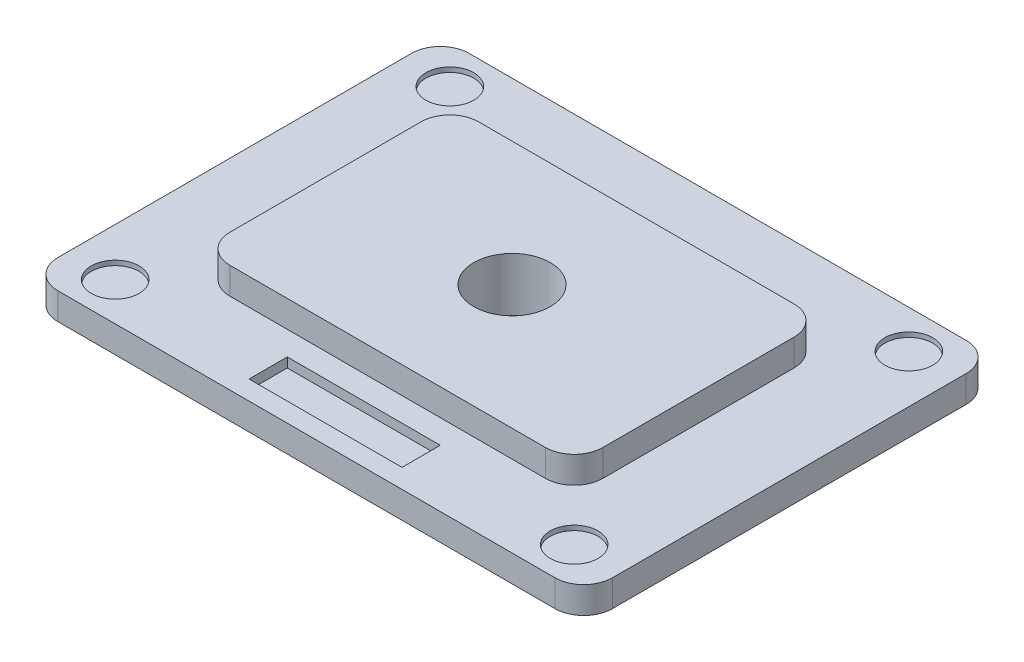
ISO-10303-21;
HEADER;
FILE_DESCRIPTION(('STEP AP214'),'2;1');
FILE_NAME('part.step','',(''),(''),'','','');
FILE_SCHEMA(('AUTOMOTIVE_DESIGN { 1 0 10303 214 1 1 1 1 }'));
ENDSEC;
DATA;
#1=APPLICATION_CONTEXT('core data for automotive mechanical design processes');
#2=APPLICATION_PROTOCOL_DEFINITION('international standard','automotive_design',2000,#1);
#3=PRODUCT_CONTEXT('',#1,'mechanical');
#4=PRODUCT('Part','Part','',(#3));
#5=PRODUCT_RELATED_PRODUCT_CATEGORY('part','',(#4));
#6=PRODUCT_DEFINITION_FORMATION('','',#4);
#7=PRODUCT_DEFINITION_CONTEXT('part definition',#1,'design');
#8=PRODUCT_DEFINITION('design','',#6,#7);
#9=PRODUCT_DEFINITION_SHAPE('','',#8);
#10=(LENGTH_UNIT() NAMED_UNIT(*) SI_UNIT(.MILLI.,.METRE.));
#11=(NAMED_UNIT(*) PLANE_ANGLE_UNIT() SI_UNIT($,.RADIAN.));
#12=(NAMED_UNIT(*) SI_UNIT($,.STERADIAN.) SOLID_ANGLE_UNIT());
#13=UNCERTAINTY_MEASURE_WITH_UNIT(LENGTH_MEASURE(1.E-05),#10,'distance_accuracy_value','');
#14=(GEOMETRIC_REPRESENTATION_CONTEXT(3) GLOBAL_UNCERTAINTY_ASSIGNED_CONTEXT((#13)) GLOBAL_UNIT_ASSIGNED_CONTEXT((#10,
#11,#12)) REPRESENTATION_CONTEXT('',''));
#15=CARTESIAN_POINT('',(0.,0.,0.));
#16=DIRECTION('',(0.,0.,1.));
#17=DIRECTION('',(1.,0.,0.));
#18=AXIS2_PLACEMENT_3D('',#15,#16,#17);
#19=CARTESIAN_POINT('',(0.,3.556,0.));
#20=DIRECTION('',(0.,-1.,0.));
#21=DIRECTION('',(0.,0.,-1.));
#22=AXIS2_PLACEMENT_3D('',#19,#20,#21);
#23=PLANE('',#22);
#24=CARTESIAN_POINT('',(-30.48,3.556,22.225));
#25=DIRECTION('',(0.,1.,0.));
#26=DIRECTION('',(0.,0.,1.));
#27=AXIS2_PLACEMENT_3D('',#24,#25,#26);
#28=CIRCLE('',#27,3.175);
#29=CARTESIAN_POINT('',(-30.48,3.556,25.4));
#30=VERTEX_POINT('',#29);
#31=EDGE_CURVE('E814',#30,#30,#28,.T.);
#32=ORIENTED_EDGE('',*,*,#31,.F.);
#33=EDGE_LOOP('',(#32));
#34=FACE_BOUND('',#33,.T.);
#35=CARTESIAN_POINT('',(-30.48,3.556,-22.225));
#36=DIRECTION('',(0.,1.,0.));
#37=DIRECTION('',(0.,0.,1.));
#38=AXIS2_PLACEMENT_3D('',#35,#36,#37);
#39=CIRCLE('',#38,3.175);
#40=CARTESIAN_POINT('',(-30.48,3.556,-19.05));
#41=VERTEX_POINT('',#40);
#42=EDGE_CURVE('E818',#41,#41,#39,.T.);
#43=ORIENTED_EDGE('',*,*,#42,.F.);
#44=EDGE_LOOP('',(#43));
#45=FACE_BOUND('',#44,.T.);
#46=CARTESIAN_POINT('',(30.48,3.556,-22.225));
#47=DIRECTION('',(0.,1.,0.));
#48=DIRECTION('',(0.,0.,1.));
#49=AXIS2_PLACEMENT_3D('',#46,#47,#48);
#50=CIRCLE('',#49,3.175);
#51=CARTESIAN_POINT('',(30.48,3.556,-19.05));
#52=VERTEX_POINT('',#51);
#53=EDGE_CURVE('E828',#52,#52,#50,.T.);
#54=ORIENTED_EDGE('',*,*,#53,.F.);
#55=EDGE_LOOP('',(#54));
#56=FACE_BOUND('',#55,.T.);
#57=CARTESIAN_POINT('',(30.48,3.556,22.225));
#58=DIRECTION('',(0.,1.,0.));
#59=DIRECTION('',(0.,0.,1.));
#60=AXIS2_PLACEMENT_3D('',#57,#58,#59);
#61=CIRCLE('',#60,3.175);
#62=CARTESIAN_POINT('',(30.48,3.556,25.4));
#63=VERTEX_POINT('',#62);
#64=EDGE_CURVE('E835',#63,#63,#61,.T.);
#65=ORIENTED_EDGE('',*,*,#64,.F.);
#66=EDGE_LOOP('',(#65));
#67=FACE_BOUND('',#66,.T.);
#68=DIRECTION('',(1.,0.,0.));
#69=VECTOR('',#68,1.);
#70=CARTESIAN_POINT('',(-10.16,3.556,24.765));
#71=LINE('',#70,#69);
#72=CARTESIAN_POINT('',(-10.16,3.556,24.765));
#73=VERTEX_POINT('',#72);
#74=CARTESIAN_POINT('',(10.16,3.556,24.765));
#75=VERTEX_POINT('',#74);
#76=EDGE_CURVE('E219',#73,#75,#71,.T.);
#77=ORIENTED_EDGE('',*,*,#76,.F.);
#78=DIRECTION('',(0.,0.,1.));
#79=VECTOR('',#78,1.);
#80=CARTESIAN_POINT('',(-10.16,3.556,19.685));
#81=LINE('',#80,#79);
#82=CARTESIAN_POINT('',(-10.16,3.556,19.685));
#83=VERTEX_POINT('',#82);
#84=EDGE_CURVE('E59',#83,#73,#81,.T.);
#85=ORIENTED_EDGE('',*,*,#84,.F.);
#86=DIRECTION('',(-1.,0.,0.));
#87=VECTOR('',#86,1.);
#88=CARTESIAN_POINT('',(-10.16,3.556,19.685));
#89=LINE('',#88,#87);
#90=CARTESIAN_POINT('',(10.16,3.556,19.685));
#91=VERTEX_POINT('',#90);
#92=EDGE_CURVE('E203',#91,#83,#89,.T.);
#93=ORIENTED_EDGE('',*,*,#92,.F.);
#94=DIRECTION('',(0.,0.,-1.));
#95=VECTOR('',#94,1.);
#96=CARTESIAN_POINT('',(10.16,3.556,19.685));
#97=LINE('',#96,#95);
#98=EDGE_CURVE('E207',#75,#91,#97,.T.);
#99=ORIENTED_EDGE('',*,*,#98,.F.);
#100=EDGE_LOOP('',(#77,#85,#93,#99));
#101=FACE_BOUND('',#100,.T.);
#102=DIRECTION('',(-1.,0.,0.));
#103=VECTOR('',#102,1.);
#104=CARTESIAN_POINT('',(-36.83,3.556,-27.305));
#105=LINE('',#104,#103);
#106=CARTESIAN_POINT('',(33.02,3.556,-27.305));
#107=VERTEX_POINT('',#106);
#108=CARTESIAN_POINT('',(-33.02,3.556,-27.305));
#109=VERTEX_POINT('',#108);
#110=EDGE_CURVE('E286',#107,#109,#105,.T.);
#111=ORIENTED_EDGE('',*,*,#110,.T.);
#112=CARTESIAN_POINT('',(-33.02,3.556,-23.495));
#113=DIRECTION('',(0.,-1.,0.));
#114=DIRECTION('',(0.,0.,-1.));
#115=AXIS2_PLACEMENT_3D('',#112,#113,#114);
#116=CIRCLE('',#115,3.81);
#117=CARTESIAN_POINT('',(-36.83,3.556,-23.495));
#118=VERTEX_POINT('',#117);
#119=EDGE_CURVE('E372',#109,#118,#116,.F.);
#120=ORIENTED_EDGE('',*,*,#119,.T.);
#121=DIRECTION('',(0.,0.,1.));
#122=VECTOR('',#121,1.);
#123=CARTESIAN_POINT('',(-36.83,3.556,27.305));
#124=LINE('',#123,#122);
#125=CARTESIAN_POINT('',(-36.83,3.556,23.495));
#126=VERTEX_POINT('',#125);
#127=EDGE_CURVE('E273',#118,#126,#124,.T.);
#128=ORIENTED_EDGE('',*,*,#127,.T.);
#129=CARTESIAN_POINT('',(-33.02,3.556,23.495));
#130=DIRECTION('',(0.,-1.,0.));
#131=DIRECTION('',(0.,0.,-1.));
#132=AXIS2_PLACEMENT_3D('',#129,#130,#131);
#133=CIRCLE('',#132,3.81);
#134=CARTESIAN_POINT('',(-33.02,3.556,27.305));
#135=VERTEX_POINT('',#134);
#136=EDGE_CURVE('E366',#126,#135,#133,.F.);
#137=ORIENTED_EDGE('',*,*,#136,.T.);
#138=DIRECTION('',(1.,0.,0.));
#139=VECTOR('',#138,1.);
#140=CARTESIAN_POINT('',(36.83,3.556,27.305));
#141=LINE('',#140,#139);
#142=CARTESIAN_POINT('',(33.02,3.556,27.305));
#143=VERTEX_POINT('',#142);
#144=EDGE_CURVE('E277',#135,#143,#141,.T.);
#145=ORIENTED_EDGE('',*,*,#144,.T.);
#146=CARTESIAN_POINT('',(33.02,3.556,23.495));
#147=DIRECTION('',(0.,-1.,0.));
#148=DIRECTION('',(0.,0.,-1.));
#149=AXIS2_PLACEMENT_3D('',#146,#147,#148);
#150=CIRCLE('',#149,3.81);
#151=CARTESIAN_POINT('',(36.83,3.556,23.495));
#152=VERTEX_POINT('',#151);
#153=EDGE_CURVE('E363',#143,#152,#150,.F.);
#154=ORIENTED_EDGE('',*,*,#153,.T.);
#155=DIRECTION('',(0.,0.,-1.));
#156=VECTOR('',#155,1.);
#157=CARTESIAN_POINT('',(36.83,3.556,-27.305));
#158=LINE('',#157,#156);
#159=CARTESIAN_POINT('',(36.83,3.556,-23.495));
#160=VERTEX_POINT('',#159);
#161=EDGE_CURVE('E282',#152,#160,#158,.T.);
#162=ORIENTED_EDGE('',*,*,#161,.T.);
#163=CARTESIAN_POINT('',(33.02,3.556,-23.495));
#164=DIRECTION('',(0.,-1.,0.));
#165=DIRECTION('',(0.,0.,-1.));
#166=AXIS2_PLACEMENT_3D('',#163,#164,#165);
#167=CIRCLE('',#166,3.81);
#168=EDGE_CURVE('E369',#160,#107,#167,.F.);
#169=ORIENTED_EDGE('',*,*,#168,.T.);
#170=EDGE_LOOP('',(#111,#120,#128,#137,#145,#154,#162,#169));
#171=FACE_BOUND('',#170,.T.);
#172=DIRECTION('',(-1.,0.,0.));
#173=VECTOR('',#172,1.);
#174=CARTESIAN_POINT('',(24.765,3.556,-16.51));
#175=LINE('',#174,#173);
#176=CARTESIAN_POINT('',(20.955,3.556,-16.51));
#177=VERTEX_POINT('',#176);
#178=CARTESIAN_POINT('',(-20.955,3.556,-16.51));
#179=VERTEX_POINT('',#178);
#180=EDGE_CURVE('E241',#177,#179,#175,.T.);
#181=ORIENTED_EDGE('',*,*,#180,.F.);
#182=CARTESIAN_POINT('',(20.955,3.556,-12.7));
#183=DIRECTION('',(0.,-1.,0.));
#184=DIRECTION('',(0.,0.,-1.));
#185=AXIS2_PLACEMENT_3D('',#182,#183,#184);
#186=CIRCLE('',#185,3.81);
#187=CARTESIAN_POINT('',(24.765,3.556,-12.7));
#188=VERTEX_POINT('',#187);
#189=EDGE_CURVE('E52',#177,#188,#186,.T.);
#190=ORIENTED_EDGE('',*,*,#189,.T.);
#191=DIRECTION('',(0.,0.,-1.));
#192=VECTOR('',#191,1.);
#193=CARTESIAN_POINT('',(24.765,3.556,16.51));
#194=LINE('',#193,#192);
#195=CARTESIAN_POINT('',(24.765,3.556,12.7));
#196=VERTEX_POINT('',#195);
#197=EDGE_CURVE('E247',#196,#188,#194,.T.);
#198=ORIENTED_EDGE('',*,*,#197,.F.);
#199=CARTESIAN_POINT('',(20.955,3.556,12.7));
#200=DIRECTION('',(0.,-1.,0.));
#201=DIRECTION('',(0.,0.,-1.));
#202=AXIS2_PLACEMENT_3D('',#199,#200,#201);
#203=CIRCLE('',#202,3.81);
#204=CARTESIAN_POINT('',(20.955,3.556,16.51));
#205=VERTEX_POINT('',#204);
#206=EDGE_CURVE('E11',#196,#205,#203,.T.);
#207=ORIENTED_EDGE('',*,*,#206,.T.);
#208=DIRECTION('',(1.,0.,0.));
#209=VECTOR('',#208,1.);
#210=CARTESIAN_POINT('',(-24.765,3.556,16.51));
#211=LINE('',#210,#209);
#212=CARTESIAN_POINT('',(-20.955,3.556,16.51));
#213=VERTEX_POINT('',#212);
#214=EDGE_CURVE('E267',#213,#205,#211,.T.);
#215=ORIENTED_EDGE('',*,*,#214,.F.);
#216=CARTESIAN_POINT('',(-20.955,3.556,12.7));
#217=DIRECTION('',(0.,-1.,0.));
#218=DIRECTION('',(0.,0.,-1.));
#219=AXIS2_PLACEMENT_3D('',#216,#217,#218);
#220=CIRCLE('',#219,3.81);
#221=CARTESIAN_POINT('',(-24.765,3.556,12.7));
#222=VERTEX_POINT('',#221);
#223=EDGE_CURVE('E396',#213,#222,#220,.T.);
#224=ORIENTED_EDGE('',*,*,#223,.T.);
#225=DIRECTION('',(0.,0.,1.));
#226=VECTOR('',#225,1.);
#227=CARTESIAN_POINT('',(-24.765,3.556,-16.51));
#228=LINE('',#227,#226);
#229=CARTESIAN_POINT('',(-24.765,3.556,-12.7));
#230=VERTEX_POINT('',#229);
#231=EDGE_CURVE('E263',#230,#222,#228,.T.);
#232=ORIENTED_EDGE('',*,*,#231,.F.);
#233=CARTESIAN_POINT('',(-20.955,3.556,-12.7));
#234=DIRECTION('',(0.,-1.,0.));
#235=DIRECTION('',(0.,0.,-1.));
#236=AXIS2_PLACEMENT_3D('',#233,#234,#235);
#237=CIRCLE('',#236,3.81);
#238=EDGE_CURVE('E399',#230,#179,#237,.T.);
#239=ORIENTED_EDGE('',*,*,#238,.T.);
#240=EDGE_LOOP('',(#181,#190,#198,#207,#215,#224,#232,#239));
#241=FACE_BOUND('',#240,.T.);
#242=ADVANCED_FACE('F43',(#34,#45,#56,#67,#101,#171,#241),#23,.F.);
#243=CARTESIAN_POINT('',(-36.83,3.556,27.305));
#244=DIRECTION('',(1.,0.,0.));
#245=DIRECTION('',(0.,0.,-1.));
#246=AXIS2_PLACEMENT_3D('',#243,#244,#245);
#247=PLANE('',#246);
#248=ORIENTED_EDGE('',*,*,#127,.F.);
#249=DIRECTION('',(0.,-1.,0.));
#250=VECTOR('',#249,1.);
#251=CARTESIAN_POINT('',(-36.83,3.556,-23.495));
#252=LINE('',#251,#250);
#253=CARTESIAN_POINT('',(-36.83,0.,-23.495));
#254=VERTEX_POINT('',#253);
#255=EDGE_CURVE('E340',#118,#254,#252,.T.);
#256=ORIENTED_EDGE('',*,*,#255,.T.);
#257=DIRECTION('',(0.,0.,1.));
#258=VECTOR('',#257,1.);
#259=CARTESIAN_POINT('',(-36.83,0.,27.305));
#260=LINE('',#259,#258);
#261=CARTESIAN_POINT('',(-36.83,0.,23.495));
#262=VERTEX_POINT('',#261);
#263=EDGE_CURVE('E259',#254,#262,#260,.T.);
#264=ORIENTED_EDGE('',*,*,#263,.T.);
#265=DIRECTION('',(0.,-1.,0.));
#266=VECTOR('',#265,1.);
#267=CARTESIAN_POINT('',(-36.83,3.556,23.495));
#268=LINE('',#267,#266);
#269=EDGE_CURVE('E337',#262,#126,#268,.F.);
#270=ORIENTED_EDGE('',*,*,#269,.T.);
#271=EDGE_LOOP('',(#248,#256,#264,#270));
#272=FACE_BOUND('',#271,.T.);
#273=ADVANCED_FACE('F452',(#272),#247,.F.);
#274=CARTESIAN_POINT('',(36.83,3.556,27.305));
#275=DIRECTION('',(0.,0.,-1.));
#276=DIRECTION('',(-1.,0.,0.));
#277=AXIS2_PLACEMENT_3D('',#274,#275,#276);
#278=PLANE('',#277);
#279=ORIENTED_EDGE('',*,*,#144,.F.);
#280=DIRECTION('',(0.,-1.,0.));
#281=VECTOR('',#280,1.);
#282=CARTESIAN_POINT('',(-33.02,3.556,27.305));
#283=LINE('',#282,#281);
#284=CARTESIAN_POINT('',(-33.02,0.,27.305));
#285=VERTEX_POINT('',#284);
#286=EDGE_CURVE('E392',#135,#285,#283,.T.);
#287=ORIENTED_EDGE('',*,*,#286,.T.);
#288=DIRECTION('',(1.,0.,0.));
#289=VECTOR('',#288,1.);
#290=CARTESIAN_POINT('',(36.83,0.,27.305));
#291=LINE('',#290,#289);
#292=CARTESIAN_POINT('',(33.02,0.,27.305));
#293=VERTEX_POINT('',#292);
#294=EDGE_CURVE('E294',#285,#293,#291,.T.);
#295=ORIENTED_EDGE('',*,*,#294,.T.);
#296=DIRECTION('',(0.,-1.,0.));
#297=VECTOR('',#296,1.);
#298=CARTESIAN_POINT('',(33.02,3.556,27.305));
#299=LINE('',#298,#297);
#300=EDGE_CURVE('E389',#293,#143,#299,.F.);
#301=ORIENTED_EDGE('',*,*,#300,.T.);
#302=EDGE_LOOP('',(#279,#287,#295,#301));
#303=FACE_BOUND('',#302,.T.);
#304=ADVANCED_FACE('F458',(#303),#278,.F.);
#305=CARTESIAN_POINT('',(36.83,3.556,-27.305));
#306=DIRECTION('',(-1.,0.,0.));
#307=DIRECTION('',(0.,0.,1.));
#308=AXIS2_PLACEMENT_3D('',#305,#306,#307);
#309=PLANE('',#308);
#310=DIRECTION('',(0.,0.,-1.));
#311=VECTOR('',#310,1.);
#312=CARTESIAN_POINT('',(36.83,0.,-27.305));
#313=LINE('',#312,#311);
#314=CARTESIAN_POINT('',(36.83,0.,23.495));
#315=VERTEX_POINT('',#314);
#316=CARTESIAN_POINT('',(36.83,0.,-23.495));
#317=VERTEX_POINT('',#316);
#318=EDGE_CURVE('E298',#315,#317,#313,.T.);
#319=ORIENTED_EDGE('',*,*,#318,.T.);
#320=DIRECTION('',(0.,-1.,0.));
#321=VECTOR('',#320,1.);
#322=CARTESIAN_POINT('',(36.83,3.556,-23.495));
#323=LINE('',#322,#321);
#324=EDGE_CURVE('E386',#317,#160,#323,.F.);
#325=ORIENTED_EDGE('',*,*,#324,.T.);
#326=ORIENTED_EDGE('',*,*,#161,.F.);
#327=DIRECTION('',(0.,-1.,0.));
#328=VECTOR('',#327,1.);
#329=CARTESIAN_POINT('',(36.83,3.556,23.495));
#330=LINE('',#329,#328);
#331=EDGE_CURVE('E382',#152,#315,#330,.T.);
#332=ORIENTED_EDGE('',*,*,#331,.T.);
#333=EDGE_LOOP('',(#319,#325,#326,#332));
#334=FACE_BOUND('',#333,.T.);
#335=ADVANCED_FACE('F473',(#334),#309,.F.);
#336=CARTESIAN_POINT('',(-36.83,3.556,-27.305));
#337=DIRECTION('',(0.,0.,1.));
#338=DIRECTION('',(1.,0.,0.));
#339=AXIS2_PLACEMENT_3D('',#336,#337,#338);
#340=PLANE('',#339);
#341=DIRECTION('',(-1.,0.,0.));
#342=VECTOR('',#341,1.);
#343=CARTESIAN_POINT('',(-36.83,0.,-27.305));
#344=LINE('',#343,#342);
#345=CARTESIAN_POINT('',(33.02,0.,-27.305));
#346=VERTEX_POINT('',#345);
#347=CARTESIAN_POINT('',(-33.02,0.,-27.305));
#348=VERTEX_POINT('',#347);
#349=EDGE_CURVE('E278',#346,#348,#344,.T.);
#350=ORIENTED_EDGE('',*,*,#349,.T.);
#351=DIRECTION('',(0.,-1.,0.));
#352=VECTOR('',#351,1.);
#353=CARTESIAN_POINT('',(-33.02,3.556,-27.305));
#354=LINE('',#353,#352);
#355=EDGE_CURVE('E360',#348,#109,#354,.F.);
#356=ORIENTED_EDGE('',*,*,#355,.T.);
#357=ORIENTED_EDGE('',*,*,#110,.F.);
#358=DIRECTION('',(0.,-1.,0.));
#359=VECTOR('',#358,1.);
#360=CARTESIAN_POINT('',(33.02,3.556,-27.305));
#361=LINE('',#360,#359);
#362=EDGE_CURVE('E356',#107,#346,#361,.T.);
#363=ORIENTED_EDGE('',*,*,#362,.T.);
#364=EDGE_LOOP('',(#350,#356,#357,#363));
#365=FACE_BOUND('',#364,.T.);
#366=ADVANCED_FACE('F469',(#365),#340,.F.);
#367=CARTESIAN_POINT('',(0.,0.,0.));
#368=DIRECTION('',(0.,-1.,0.));
#369=DIRECTION('',(0.,0.,-1.));
#370=AXIS2_PLACEMENT_3D('',#367,#368,#369);
#371=PLANE('',#370);
#372=CARTESIAN_POINT('',(0.,0.,0.));
#373=DIRECTION('',(0.,1.,0.));
#374=DIRECTION('',(0.,0.,1.));
#375=AXIS2_PLACEMENT_3D('',#372,#373,#374);
#376=CIRCLE('',#375,5.08);
#377=CARTESIAN_POINT('',(0.,0.,5.08));
#378=VERTEX_POINT('',#377);
#379=EDGE_CURVE('E237',#378,#378,#376,.T.);
#380=ORIENTED_EDGE('',*,*,#379,.T.);
#381=EDGE_LOOP('',(#380));
#382=FACE_BOUND('',#381,.T.);
#383=ORIENTED_EDGE('',*,*,#263,.F.);
#384=CARTESIAN_POINT('',(-33.02,0.,-23.495));
#385=DIRECTION('',(0.,-1.,0.));
#386=DIRECTION('',(0.,0.,-1.));
#387=AXIS2_PLACEMENT_3D('',#384,#385,#386);
#388=CIRCLE('',#387,3.81);
#389=EDGE_CURVE('E353',#254,#348,#388,.T.);
#390=ORIENTED_EDGE('',*,*,#389,.T.);
#391=ORIENTED_EDGE('',*,*,#349,.F.);
#392=CARTESIAN_POINT('',(33.02,0.,-23.495));
#393=DIRECTION('',(0.,-1.,0.));
#394=DIRECTION('',(0.,0.,-1.));
#395=AXIS2_PLACEMENT_3D('',#392,#393,#394);
#396=CIRCLE('',#395,3.81);
#397=EDGE_CURVE('E350',#346,#317,#396,.T.);
#398=ORIENTED_EDGE('',*,*,#397,.T.);
#399=ORIENTED_EDGE('',*,*,#318,.F.);
#400=CARTESIAN_POINT('',(33.02,0.,23.495));
#401=DIRECTION('',(0.,-1.,0.));
#402=DIRECTION('',(0.,0.,-1.));
#403=AXIS2_PLACEMENT_3D('',#400,#401,#402);
#404=CIRCLE('',#403,3.81);
#405=EDGE_CURVE('E344',#315,#293,#404,.T.);
#406=ORIENTED_EDGE('',*,*,#405,.T.);
#407=ORIENTED_EDGE('',*,*,#294,.F.);
#408=CARTESIAN_POINT('',(-33.02,0.,23.495));
#409=DIRECTION('',(0.,-1.,0.));
#410=DIRECTION('',(0.,0.,-1.));
#411=AXIS2_PLACEMENT_3D('',#408,#409,#410);
#412=CIRCLE('',#411,3.81);
#413=EDGE_CURVE('E347',#285,#262,#412,.T.);
#414=ORIENTED_EDGE('',*,*,#413,.T.);
#415=EDGE_LOOP('',(#383,#390,#391,#398,#399,#406,#407,#414));
#416=FACE_BOUND('',#415,.T.);
#417=ADVANCED_FACE('F466',(#382,#416),#371,.T.);
#418=CARTESIAN_POINT('',(24.765,7.112,-16.51));
#419=DIRECTION('',(0.,0.,1.));
#420=DIRECTION('',(1.,0.,0.));
#421=AXIS2_PLACEMENT_3D('',#418,#419,#420);
#422=PLANE('',#421);
#423=ORIENTED_EDGE('',*,*,#180,.T.);
#424=DIRECTION('',(0.,-1.,0.));
#425=VECTOR('',#424,1.);
#426=CARTESIAN_POINT('',(-20.955,7.112,-16.51));
#427=LINE('',#426,#425);
#428=CARTESIAN_POINT('',(-20.955,7.112,-16.51));
#429=VERTEX_POINT('',#428);
#430=EDGE_CURVE('E334',#179,#429,#427,.F.);
#431=ORIENTED_EDGE('',*,*,#430,.T.);
#432=DIRECTION('',(-1.,0.,0.));
#433=VECTOR('',#432,1.);
#434=CARTESIAN_POINT('',(24.765,7.112,-16.51));
#435=LINE('',#434,#433);
#436=CARTESIAN_POINT('',(20.955,7.112,-16.51));
#437=VERTEX_POINT('',#436);
#438=EDGE_CURVE('E242',#437,#429,#435,.T.);
#439=ORIENTED_EDGE('',*,*,#438,.F.);
#440=DIRECTION('',(0.,-1.,0.));
#441=VECTOR('',#440,1.);
#442=CARTESIAN_POINT('',(20.955,7.112,-16.51));
#443=LINE('',#442,#441);
#444=EDGE_CURVE('E330',#437,#177,#443,.T.);
#445=ORIENTED_EDGE('',*,*,#444,.T.);
#446=EDGE_LOOP('',(#423,#431,#439,#445));
#447=FACE_BOUND('',#446,.T.);
#448=ADVANCED_FACE('F407',(#447),#422,.F.);
#449=CARTESIAN_POINT('',(-24.765,7.112,-16.51));
#450=DIRECTION('',(1.,0.,0.));
#451=DIRECTION('',(0.,0.,-1.));
#452=AXIS2_PLACEMENT_3D('',#449,#450,#451);
#453=PLANE('',#452);
#454=ORIENTED_EDGE('',*,*,#231,.T.);
#455=DIRECTION('',(0.,-1.,0.));
#456=VECTOR('',#455,1.);
#457=CARTESIAN_POINT('',(-24.765,7.112,12.7));
#458=LINE('',#457,#456);
#459=CARTESIAN_POINT('',(-24.765,7.112,12.7));
#460=VERTEX_POINT('',#459);
#461=EDGE_CURVE('E315',#222,#460,#458,.F.);
#462=ORIENTED_EDGE('',*,*,#461,.T.);
#463=DIRECTION('',(0.,0.,1.));
#464=VECTOR('',#463,1.);
#465=CARTESIAN_POINT('',(-24.765,7.112,-16.51));
#466=LINE('',#465,#464);
#467=CARTESIAN_POINT('',(-24.765,7.112,-12.7));
#468=VERTEX_POINT('',#467);
#469=EDGE_CURVE('E246',#468,#460,#466,.T.);
#470=ORIENTED_EDGE('',*,*,#469,.F.);
#471=DIRECTION('',(0.,-1.,0.));
#472=VECTOR('',#471,1.);
#473=CARTESIAN_POINT('',(-24.765,7.112,-12.7));
#474=LINE('',#473,#472);
#475=EDGE_CURVE('E311',#468,#230,#474,.T.);
#476=ORIENTED_EDGE('',*,*,#475,.T.);
#477=EDGE_LOOP('',(#454,#462,#470,#476));
#478=FACE_BOUND('',#477,.T.);
#479=ADVANCED_FACE('F417',(#478),#453,.F.);
#480=CARTESIAN_POINT('',(-24.765,7.112,16.51));
#481=DIRECTION('',(0.,0.,-1.));
#482=DIRECTION('',(-1.,0.,0.));
#483=AXIS2_PLACEMENT_3D('',#480,#481,#482);
#484=PLANE('',#483);
#485=DIRECTION('',(1.,0.,0.));
#486=VECTOR('',#485,1.);
#487=CARTESIAN_POINT('',(-24.765,7.112,16.51));
#488=LINE('',#487,#486);
#489=CARTESIAN_POINT('',(-20.955,7.112,16.51));
#490=VERTEX_POINT('',#489);
#491=CARTESIAN_POINT('',(20.955,7.112,16.51));
#492=VERTEX_POINT('',#491);
#493=EDGE_CURVE('E251',#490,#492,#488,.T.);
#494=ORIENTED_EDGE('',*,*,#493,.F.);
#495=DIRECTION('',(0.,-1.,0.));
#496=VECTOR('',#495,1.);
#497=CARTESIAN_POINT('',(-20.955,7.112,16.51));
#498=LINE('',#497,#496);
#499=EDGE_CURVE('E307',#490,#213,#498,.T.);
#500=ORIENTED_EDGE('',*,*,#499,.T.);
#501=ORIENTED_EDGE('',*,*,#214,.T.);
#502=DIRECTION('',(0.,-1.,0.));
#503=VECTOR('',#502,1.);
#504=CARTESIAN_POINT('',(20.955,7.112,16.51));
#505=LINE('',#504,#503);
#506=EDGE_CURVE('E290',#205,#492,#505,.F.);
#507=ORIENTED_EDGE('',*,*,#506,.T.);
#508=EDGE_LOOP('',(#494,#500,#501,#507));
#509=FACE_BOUND('',#508,.T.);
#510=ADVANCED_FACE('F425',(#509),#484,.F.);
#511=CARTESIAN_POINT('',(24.765,7.112,16.51));
#512=DIRECTION('',(-1.,0.,0.));
#513=DIRECTION('',(0.,0.,1.));
#514=AXIS2_PLACEMENT_3D('',#511,#512,#513);
#515=PLANE('',#514);
#516=ORIENTED_EDGE('',*,*,#197,.T.);
#517=DIRECTION('',(0.,-1.,0.));
#518=VECTOR('',#517,1.);
#519=CARTESIAN_POINT('',(24.765,7.112,-12.7));
#520=LINE('',#519,#518);
#521=CARTESIAN_POINT('',(24.765,7.112,-12.7));
#522=VERTEX_POINT('',#521);
#523=EDGE_CURVE('E379',#188,#522,#520,.F.);
#524=ORIENTED_EDGE('',*,*,#523,.T.);
#525=DIRECTION('',(0.,0.,-1.));
#526=VECTOR('',#525,1.);
#527=CARTESIAN_POINT('',(24.765,7.112,16.51));
#528=LINE('',#527,#526);
#529=CARTESIAN_POINT('',(24.765,7.112,12.7));
#530=VERTEX_POINT('',#529);
#531=EDGE_CURVE('E255',#530,#522,#528,.T.);
#532=ORIENTED_EDGE('',*,*,#531,.F.);
#533=DIRECTION('',(0.,-1.,0.));
#534=VECTOR('',#533,1.);
#535=CARTESIAN_POINT('',(24.765,7.112,12.7));
#536=LINE('',#535,#534);
#537=EDGE_CURVE('E375',#530,#196,#536,.T.);
#538=ORIENTED_EDGE('',*,*,#537,.T.);
#539=EDGE_LOOP('',(#516,#524,#532,#538));
#540=FACE_BOUND('',#539,.T.);
#541=ADVANCED_FACE('F434',(#540),#515,.F.);
#542=CARTESIAN_POINT('',(0.,7.112,0.));
#543=DIRECTION('',(0.,1.,0.));
#544=DIRECTION('',(0.,0.,1.));
#545=AXIS2_PLACEMENT_3D('',#542,#543,#544);
#546=PLANE('',#545);
#547=CARTESIAN_POINT('',(0.,7.112,0.));
#548=DIRECTION('',(0.,1.,0.));
#549=DIRECTION('',(0.,0.,1.));
#550=AXIS2_PLACEMENT_3D('',#547,#548,#549);
#551=CIRCLE('',#550,5.08);
#552=CARTESIAN_POINT('',(0.,7.112,5.08));
#553=VERTEX_POINT('',#552);
#554=EDGE_CURVE('E228',#553,#553,#551,.T.);
#555=ORIENTED_EDGE('',*,*,#554,.F.);
#556=EDGE_LOOP('',(#555));
#557=FACE_BOUND('',#556,.T.);
#558=ORIENTED_EDGE('',*,*,#469,.T.);
#559=CARTESIAN_POINT('',(-20.955,7.112,12.7));
#560=DIRECTION('',(0.,1.,0.));
#561=DIRECTION('',(0.,0.,1.));
#562=AXIS2_PLACEMENT_3D('',#559,#560,#561);
#563=CIRCLE('',#562,3.81);
#564=EDGE_CURVE('E327',#460,#490,#563,.T.);
#565=ORIENTED_EDGE('',*,*,#564,.T.);
#566=ORIENTED_EDGE('',*,*,#493,.T.);
#567=CARTESIAN_POINT('',(20.955,7.112,12.7));
#568=DIRECTION('',(0.,1.,0.));
#569=DIRECTION('',(0.,0.,1.));
#570=AXIS2_PLACEMENT_3D('',#567,#568,#569);
#571=CIRCLE('',#570,3.81);
#572=EDGE_CURVE('E318',#492,#530,#571,.T.);
#573=ORIENTED_EDGE('',*,*,#572,.T.);
#574=ORIENTED_EDGE('',*,*,#531,.T.);
#575=CARTESIAN_POINT('',(20.955,7.112,-12.7));
#576=DIRECTION('',(0.,1.,0.));
#577=DIRECTION('',(0.,0.,1.));
#578=AXIS2_PLACEMENT_3D('',#575,#576,#577);
#579=CIRCLE('',#578,3.81);
#580=EDGE_CURVE('E321',#522,#437,#579,.T.);
#581=ORIENTED_EDGE('',*,*,#580,.T.);
#582=ORIENTED_EDGE('',*,*,#438,.T.);
#583=CARTESIAN_POINT('',(-20.955,7.112,-12.7));
#584=DIRECTION('',(0.,1.,0.));
#585=DIRECTION('',(0.,0.,1.));
#586=AXIS2_PLACEMENT_3D('',#583,#584,#585);
#587=CIRCLE('',#586,3.81);
#588=EDGE_CURVE('E324',#429,#468,#587,.T.);
#589=ORIENTED_EDGE('',*,*,#588,.T.);
#590=EDGE_LOOP('',(#558,#565,#566,#573,#574,#581,#582,#589));
#591=FACE_BOUND('',#590,.T.);
#592=ADVANCED_FACE('F414',(#557,#591),#546,.T.);
#593=CARTESIAN_POINT('',(-20.955,7.112,12.7));
#594=DIRECTION('',(0.,-1.,0.));
#595=DIRECTION('',(0.,0.,-1.));
#596=AXIS2_PLACEMENT_3D('',#593,#594,#595);
#597=CYLINDRICAL_SURFACE('',#596,3.81);
#598=ORIENTED_EDGE('',*,*,#564,.F.);
#599=ORIENTED_EDGE('',*,*,#461,.F.);
#600=ORIENTED_EDGE('',*,*,#223,.F.);
#601=ORIENTED_EDGE('',*,*,#499,.F.);
#602=EDGE_LOOP('',(#598,#599,#600,#601));
#603=FACE_BOUND('',#602,.T.);
#604=ADVANCED_FACE('F420',(#603),#597,.T.);
#605=CARTESIAN_POINT('',(-20.955,7.112,-12.7));
#606=DIRECTION('',(0.,-1.,0.));
#607=DIRECTION('',(0.,0.,-1.));
#608=AXIS2_PLACEMENT_3D('',#605,#606,#607);
#609=CYLINDRICAL_SURFACE('',#608,3.81);
#610=ORIENTED_EDGE('',*,*,#588,.F.);
#611=ORIENTED_EDGE('',*,*,#430,.F.);
#612=ORIENTED_EDGE('',*,*,#238,.F.);
#613=ORIENTED_EDGE('',*,*,#475,.F.);
#614=EDGE_LOOP('',(#610,#611,#612,#613));
#615=FACE_BOUND('',#614,.T.);
#616=ADVANCED_FACE('F411',(#615),#609,.T.);
#617=CARTESIAN_POINT('',(-33.02,3.556,-23.495));
#618=DIRECTION('',(0.,-1.,0.));
#619=DIRECTION('',(0.,0.,-1.));
#620=AXIS2_PLACEMENT_3D('',#617,#618,#619);
#621=CYLINDRICAL_SURFACE('',#620,3.81);
#622=ORIENTED_EDGE('',*,*,#119,.F.);
#623=ORIENTED_EDGE('',*,*,#355,.F.);
#624=ORIENTED_EDGE('',*,*,#389,.F.);
#625=ORIENTED_EDGE('',*,*,#255,.F.);
#626=EDGE_LOOP('',(#622,#623,#624,#625));
#627=FACE_BOUND('',#626,.T.);
#628=ADVANCED_FACE('F440',(#627),#621,.T.);
#629=CARTESIAN_POINT('',(20.955,7.112,-12.7));
#630=DIRECTION('',(0.,-1.,0.));
#631=DIRECTION('',(0.,0.,-1.));
#632=AXIS2_PLACEMENT_3D('',#629,#630,#631);
#633=CYLINDRICAL_SURFACE('',#632,3.81);
#634=ORIENTED_EDGE('',*,*,#580,.F.);
#635=ORIENTED_EDGE('',*,*,#523,.F.);
#636=ORIENTED_EDGE('',*,*,#189,.F.);
#637=ORIENTED_EDGE('',*,*,#444,.F.);
#638=EDGE_LOOP('',(#634,#635,#636,#637));
#639=FACE_BOUND('',#638,.T.);
#640=ADVANCED_FACE('F437',(#639),#633,.T.);
#641=CARTESIAN_POINT('',(33.02,3.556,-23.495));
#642=DIRECTION('',(0.,-1.,0.));
#643=DIRECTION('',(0.,0.,-1.));
#644=AXIS2_PLACEMENT_3D('',#641,#642,#643);
#645=CYLINDRICAL_SURFACE('',#644,3.81);
#646=ORIENTED_EDGE('',*,*,#168,.F.);
#647=ORIENTED_EDGE('',*,*,#324,.F.);
#648=ORIENTED_EDGE('',*,*,#397,.F.);
#649=ORIENTED_EDGE('',*,*,#362,.F.);
#650=EDGE_LOOP('',(#646,#647,#648,#649));
#651=FACE_BOUND('',#650,.T.);
#652=ADVANCED_FACE('F439',(#651),#645,.T.);
#653=CARTESIAN_POINT('',(-33.02,3.556,23.495));
#654=DIRECTION('',(0.,-1.,0.));
#655=DIRECTION('',(0.,0.,-1.));
#656=AXIS2_PLACEMENT_3D('',#653,#654,#655);
#657=CYLINDRICAL_SURFACE('',#656,3.81);
#658=ORIENTED_EDGE('',*,*,#136,.F.);
#659=ORIENTED_EDGE('',*,*,#269,.F.);
#660=ORIENTED_EDGE('',*,*,#413,.F.);
#661=ORIENTED_EDGE('',*,*,#286,.F.);
#662=EDGE_LOOP('',(#658,#659,#660,#661));
#663=FACE_BOUND('',#662,.T.);
#664=ADVANCED_FACE('F446',(#663),#657,.T.);
#665=CARTESIAN_POINT('',(20.955,7.112,12.7));
#666=DIRECTION('',(0.,-1.,0.));
#667=DIRECTION('',(0.,0.,-1.));
#668=AXIS2_PLACEMENT_3D('',#665,#666,#667);
#669=CYLINDRICAL_SURFACE('',#668,3.81);
#670=ORIENTED_EDGE('',*,*,#572,.F.);
#671=ORIENTED_EDGE('',*,*,#506,.F.);
#672=ORIENTED_EDGE('',*,*,#206,.F.);
#673=ORIENTED_EDGE('',*,*,#537,.F.);
#674=EDGE_LOOP('',(#670,#671,#672,#673));
#675=FACE_BOUND('',#674,.T.);
#676=ADVANCED_FACE('F429',(#675),#669,.T.);
#677=CARTESIAN_POINT('',(33.02,3.556,23.495));
#678=DIRECTION('',(0.,-1.,0.));
#679=DIRECTION('',(0.,0.,-1.));
#680=AXIS2_PLACEMENT_3D('',#677,#678,#679);
#681=CYLINDRICAL_SURFACE('',#680,3.81);
#682=ORIENTED_EDGE('',*,*,#153,.F.);
#683=ORIENTED_EDGE('',*,*,#300,.F.);
#684=ORIENTED_EDGE('',*,*,#405,.F.);
#685=ORIENTED_EDGE('',*,*,#331,.F.);
#686=EDGE_LOOP('',(#682,#683,#684,#685));
#687=FACE_BOUND('',#686,.T.);
#688=ADVANCED_FACE('F45',(#687),#681,.T.);
#689=CARTESIAN_POINT('',(0.,7.112,0.));
#690=DIRECTION('',(0.,1.,0.));
#691=DIRECTION('',(0.,0.,1.));
#692=AXIS2_PLACEMENT_3D('',#689,#690,#691);
#693=CYLINDRICAL_SURFACE('',#692,5.08);
#694=ORIENTED_EDGE('',*,*,#379,.F.);
#695=EDGE_LOOP('',(#694));
#696=FACE_BOUND('',#695,.T.);
#697=ORIENTED_EDGE('',*,*,#554,.T.);
#698=EDGE_LOOP('',(#697));
#699=FACE_BOUND('',#698,.T.);
#700=ADVANCED_FACE('F533',(#696,#699),#693,.F.);
#701=CARTESIAN_POINT('',(-10.16,2.286,19.685));
#702=DIRECTION('',(-1.,0.,0.));
#703=DIRECTION('',(0.,0.,1.));
#704=AXIS2_PLACEMENT_3D('',#701,#702,#703);
#705=PLANE('',#704);
#706=ORIENTED_EDGE('',*,*,#84,.T.);
#707=DIRECTION('',(0.,1.,0.));
#708=VECTOR('',#707,1.);
#709=CARTESIAN_POINT('',(-10.16,2.286,24.765));
#710=LINE('',#709,#708);
#711=CARTESIAN_POINT('',(-10.16,2.286,24.765));
#712=VERTEX_POINT('',#711);
#713=EDGE_CURVE('E178',#712,#73,#710,.T.);
#714=ORIENTED_EDGE('',*,*,#713,.F.);
#715=DIRECTION('',(0.,0.,1.));
#716=VECTOR('',#715,1.);
#717=CARTESIAN_POINT('',(-10.16,2.286,19.685));
#718=LINE('',#717,#716);
#719=CARTESIAN_POINT('',(-10.16,2.286,19.685));
#720=VERTEX_POINT('',#719);
#721=EDGE_CURVE('E182',#720,#712,#718,.T.);
#722=ORIENTED_EDGE('',*,*,#721,.F.);
#723=DIRECTION('',(0.,1.,0.));
#724=VECTOR('',#723,1.);
#725=CARTESIAN_POINT('',(-10.16,2.286,19.685));
#726=LINE('',#725,#724);
#727=EDGE_CURVE('E225',#720,#83,#726,.T.);
#728=ORIENTED_EDGE('',*,*,#727,.T.);
#729=EDGE_LOOP('',(#706,#714,#722,#728));
#730=FACE_BOUND('',#729,.T.);
#731=ADVANCED_FACE('F180',(#730),#705,.F.);
#732=CARTESIAN_POINT('',(-10.16,2.286,19.685));
#733=DIRECTION('',(0.,0.,-1.));
#734=DIRECTION('',(-1.,0.,0.));
#735=AXIS2_PLACEMENT_3D('',#732,#733,#734);
#736=PLANE('',#735);
#737=ORIENTED_EDGE('',*,*,#92,.T.);
#738=ORIENTED_EDGE('',*,*,#727,.F.);
#739=DIRECTION('',(-1.,0.,0.));
#740=VECTOR('',#739,1.);
#741=CARTESIAN_POINT('',(-10.16,2.286,19.685));
#742=LINE('',#741,#740);
#743=CARTESIAN_POINT('',(10.16,2.286,19.685));
#744=VERTEX_POINT('',#743);
#745=EDGE_CURVE('E189',#744,#720,#742,.T.);
#746=ORIENTED_EDGE('',*,*,#745,.F.);
#747=DIRECTION('',(0.,1.,0.));
#748=VECTOR('',#747,1.);
#749=CARTESIAN_POINT('',(10.16,2.286,19.685));
#750=LINE('',#749,#748);
#751=EDGE_CURVE('E229',#744,#91,#750,.T.);
#752=ORIENTED_EDGE('',*,*,#751,.T.);
#753=EDGE_LOOP('',(#737,#738,#746,#752));
#754=FACE_BOUND('',#753,.T.);
#755=ADVANCED_FACE('F575',(#754),#736,.F.);
#756=CARTESIAN_POINT('',(10.16,2.286,19.685));
#757=DIRECTION('',(1.,0.,0.));
#758=DIRECTION('',(0.,0.,-1.));
#759=AXIS2_PLACEMENT_3D('',#756,#757,#758);
#760=PLANE('',#759);
#761=ORIENTED_EDGE('',*,*,#98,.T.);
#762=ORIENTED_EDGE('',*,*,#751,.F.);
#763=DIRECTION('',(0.,0.,-1.));
#764=VECTOR('',#763,1.);
#765=CARTESIAN_POINT('',(10.16,2.286,19.685));
#766=LINE('',#765,#764);
#767=CARTESIAN_POINT('',(10.16,2.286,24.765));
#768=VERTEX_POINT('',#767);
#769=EDGE_CURVE('E198',#768,#744,#766,.T.);
#770=ORIENTED_EDGE('',*,*,#769,.F.);
#771=DIRECTION('',(0.,1.,0.));
#772=VECTOR('',#771,1.);
#773=CARTESIAN_POINT('',(10.16,2.286,24.765));
#774=LINE('',#773,#772);
#775=EDGE_CURVE('E188',#768,#75,#774,.T.);
#776=ORIENTED_EDGE('',*,*,#775,.T.);
#777=EDGE_LOOP('',(#761,#762,#770,#776));
#778=FACE_BOUND('',#777,.T.);
#779=ADVANCED_FACE('F585',(#778),#760,.F.);
#780=CARTESIAN_POINT('',(-10.16,2.286,24.765));
#781=DIRECTION('',(0.,0.,1.));
#782=DIRECTION('',(1.,0.,0.));
#783=AXIS2_PLACEMENT_3D('',#780,#781,#782);
#784=PLANE('',#783);
#785=ORIENTED_EDGE('',*,*,#76,.T.);
#786=ORIENTED_EDGE('',*,*,#775,.F.);
#787=DIRECTION('',(1.,0.,0.));
#788=VECTOR('',#787,1.);
#789=CARTESIAN_POINT('',(-10.16,2.286,24.765));
#790=LINE('',#789,#788);
#791=EDGE_CURVE('E192',#712,#768,#790,.T.);
#792=ORIENTED_EDGE('',*,*,#791,.F.);
#793=ORIENTED_EDGE('',*,*,#713,.T.);
#794=EDGE_LOOP('',(#785,#786,#792,#793));
#795=FACE_BOUND('',#794,.T.);
#796=ADVANCED_FACE('F193',(#795),#784,.F.);
#797=CARTESIAN_POINT('',(0.,2.286,0.));
#798=DIRECTION('',(0.,1.,0.));
#799=DIRECTION('',(0.,0.,1.));
#800=AXIS2_PLACEMENT_3D('',#797,#798,#799);
#801=PLANE('',#800);
#802=ORIENTED_EDGE('',*,*,#721,.T.);
#803=ORIENTED_EDGE('',*,*,#791,.T.);
#804=ORIENTED_EDGE('',*,*,#769,.T.);
#805=ORIENTED_EDGE('',*,*,#745,.T.);
#806=EDGE_LOOP('',(#802,#803,#804,#805));
#807=FACE_BOUND('',#806,.T.);
#808=ADVANCED_FACE('F200',(#807),#801,.T.);
#809=CARTESIAN_POINT('',(30.48,2.921,22.225));
#810=DIRECTION('',(0.,-1.,0.));
#811=DIRECTION('',(0.,0.,-1.));
#812=AXIS2_PLACEMENT_3D('',#809,#810,#811);
#813=PLANE('',#812);
#814=CARTESIAN_POINT('',(30.48,2.921,22.225));
#815=DIRECTION('',(0.,1.,0.));
#816=DIRECTION('',(0.,0.,1.));
#817=AXIS2_PLACEMENT_3D('',#814,#815,#816);
#818=CIRCLE('',#817,3.175);
#819=CARTESIAN_POINT('',(30.48,2.921,25.4));
#820=VERTEX_POINT('',#819);
#821=EDGE_CURVE('E210',#820,#820,#818,.T.);
#822=ORIENTED_EDGE('',*,*,#821,.T.);
#823=EDGE_LOOP('',(#822));
#824=FACE_BOUND('',#823,.T.);
#825=ADVANCED_FACE('F614',(#824),#813,.F.);
#826=CARTESIAN_POINT('',(30.48,3.556,22.225));
#827=DIRECTION('',(0.,1.,0.));
#828=DIRECTION('',(0.,0.,1.));
#829=AXIS2_PLACEMENT_3D('',#826,#827,#828);
#830=CYLINDRICAL_SURFACE('',#829,3.175);
#831=ORIENTED_EDGE('',*,*,#821,.F.);
#832=EDGE_LOOP('',(#831));
#833=FACE_BOUND('',#832,.T.);
#834=ORIENTED_EDGE('',*,*,#64,.T.);
#835=EDGE_LOOP('',(#834));
#836=FACE_BOUND('',#835,.T.);
#837=ADVANCED_FACE('F629',(#833,#836),#830,.F.);
#838=CARTESIAN_POINT('',(30.48,2.921,-22.225));
#839=DIRECTION('',(0.,-1.,0.));
#840=DIRECTION('',(0.,0.,-1.));
#841=AXIS2_PLACEMENT_3D('',#838,#839,#840);
#842=PLANE('',#841);
#843=CARTESIAN_POINT('',(30.48,2.921,-22.225));
#844=DIRECTION('',(0.,1.,0.));
#845=DIRECTION('',(0.,0.,1.));
#846=AXIS2_PLACEMENT_3D('',#843,#844,#845);
#847=CIRCLE('',#846,3.175);
#848=CARTESIAN_POINT('',(30.48,2.921,-19.05));
#849=VERTEX_POINT('',#848);
#850=EDGE_CURVE('E832',#849,#849,#847,.T.);
#851=ORIENTED_EDGE('',*,*,#850,.T.);
#852=EDGE_LOOP('',(#851));
#853=FACE_BOUND('',#852,.T.);
#854=ADVANCED_FACE('F640',(#853),#842,.F.);
#855=CARTESIAN_POINT('',(30.48,3.556,-22.225));
#856=DIRECTION('',(0.,1.,0.));
#857=DIRECTION('',(0.,0.,1.));
#858=AXIS2_PLACEMENT_3D('',#855,#856,#857);
#859=CYLINDRICAL_SURFACE('',#858,3.175);
#860=ORIENTED_EDGE('',*,*,#850,.F.);
#861=EDGE_LOOP('',(#860));
#862=FACE_BOUND('',#861,.T.);
#863=ORIENTED_EDGE('',*,*,#53,.T.);
#864=EDGE_LOOP('',(#863));
#865=FACE_BOUND('',#864,.T.);
#866=ADVANCED_FACE('F651',(#862,#865),#859,.F.);
#867=CARTESIAN_POINT('',(-30.48,2.921,-22.225));
#868=DIRECTION('',(0.,-1.,0.));
#869=DIRECTION('',(0.,0.,-1.));
#870=AXIS2_PLACEMENT_3D('',#867,#868,#869);
#871=PLANE('',#870);
#872=CARTESIAN_POINT('',(-30.48,2.921,-22.225));
#873=DIRECTION('',(0.,1.,0.));
#874=DIRECTION('',(0.,0.,1.));
#875=AXIS2_PLACEMENT_3D('',#872,#873,#874);
#876=CIRCLE('',#875,3.175);
#877=CARTESIAN_POINT('',(-30.48,2.921,-19.05));
#878=VERTEX_POINT('',#877);
#879=EDGE_CURVE('E824',#878,#878,#876,.T.);
#880=ORIENTED_EDGE('',*,*,#879,.T.);
#881=EDGE_LOOP('',(#880));
#882=FACE_BOUND('',#881,.T.);
#883=ADVANCED_FACE('F662',(#882),#871,.F.);
#884=CARTESIAN_POINT('',(-30.48,3.556,-22.225));
#885=DIRECTION('',(0.,1.,0.));
#886=DIRECTION('',(0.,0.,1.));
#887=AXIS2_PLACEMENT_3D('',#884,#885,#886);
#888=CYLINDRICAL_SURFACE('',#887,3.175);
#889=ORIENTED_EDGE('',*,*,#879,.F.);
#890=EDGE_LOOP('',(#889));
#891=FACE_BOUND('',#890,.T.);
#892=ORIENTED_EDGE('',*,*,#42,.T.);
#893=EDGE_LOOP('',(#892));
#894=FACE_BOUND('',#893,.T.);
#895=ADVANCED_FACE('F673',(#891,#894),#888,.F.);
#896=CARTESIAN_POINT('',(-30.48,2.921,22.225));
#897=DIRECTION('',(0.,-1.,0.));
#898=DIRECTION('',(0.,0.,-1.));
#899=AXIS2_PLACEMENT_3D('',#896,#897,#898);
#900=PLANE('',#899);
#901=CARTESIAN_POINT('',(-30.48,2.921,22.225));
#902=DIRECTION('',(0.,1.,0.));
#903=DIRECTION('',(0.,0.,1.));
#904=AXIS2_PLACEMENT_3D('',#901,#902,#903);
#905=CIRCLE('',#904,3.175);
#906=CARTESIAN_POINT('',(-30.48,2.921,25.4));
#907=VERTEX_POINT('',#906);
#908=EDGE_CURVE('E812',#907,#907,#905,.T.);
#909=ORIENTED_EDGE('',*,*,#908,.T.);
#910=EDGE_LOOP('',(#909));
#911=FACE_BOUND('',#910,.T.);
#912=ADVANCED_FACE('F684',(#911),#900,.F.);
#913=CARTESIAN_POINT('',(-30.48,3.556,22.225));
#914=DIRECTION('',(0.,1.,0.));
#915=DIRECTION('',(0.,0.,1.));
#916=AXIS2_PLACEMENT_3D('',#913,#914,#915);
#917=CYLINDRICAL_SURFACE('',#916,3.175);
#918=ORIENTED_EDGE('',*,*,#908,.F.);
#919=EDGE_LOOP('',(#918));
#920=FACE_BOUND('',#919,.T.);
#921=ORIENTED_EDGE('',*,*,#31,.T.);
#922=EDGE_LOOP('',(#921));
#923=FACE_BOUND('',#922,.T.);
#924=ADVANCED_FACE('F695',(#920,#923),#917,.F.);
#925=CLOSED_SHELL('',(#242,#273,#304,#335,#366,#417,#448,#479,#510,#541,#592,#604,#616,#628,
#640,#652,#664,#676,#688,#700,#731,#755,#779,#796,#808,#825,#837,#854,#866,#883,#895,#912,#924));
#926=MANIFOLD_SOLID_BREP('B2',#925);
#927=ADVANCED_BREP_SHAPE_REPRESENTATION('',(#18,#926),#14);
#928=SHAPE_DEFINITION_REPRESENTATION(#9,#927);
ENDSEC;
END-ISO-10303-21;
